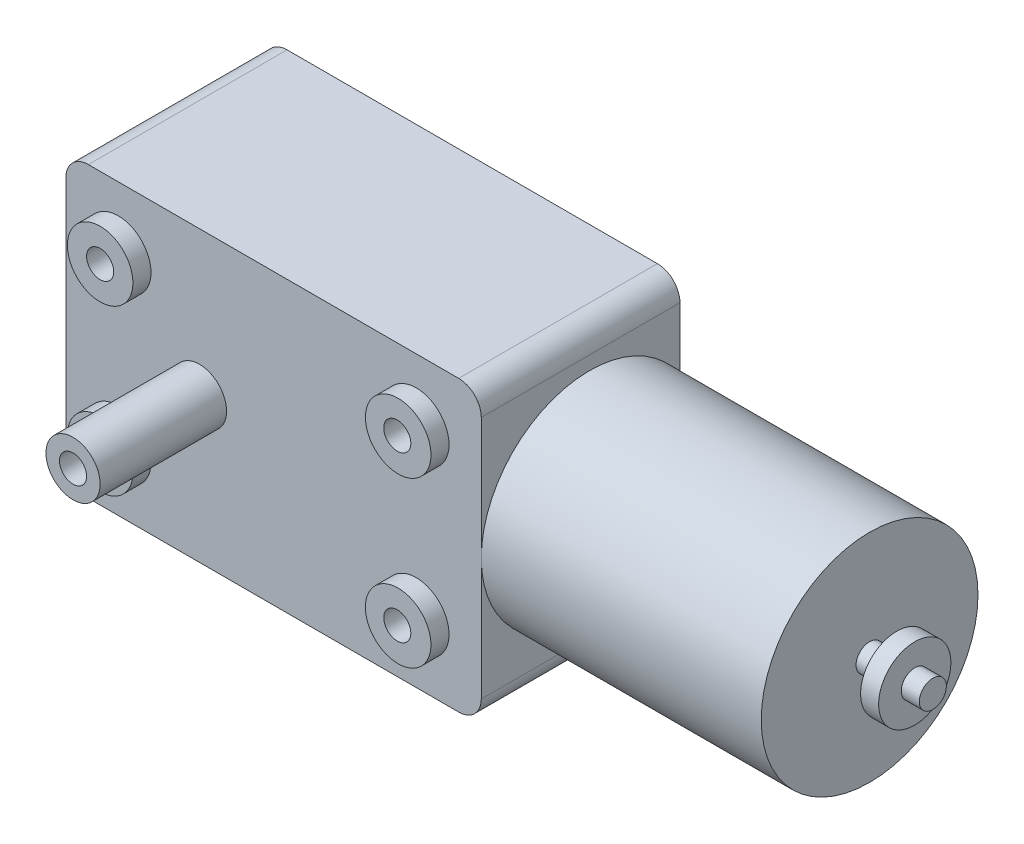
ISO-10303-21;
HEADER;
FILE_DESCRIPTION(('STEP AP214'),'2;1');
FILE_NAME('part.step','',(''),(''),'','','');
FILE_SCHEMA(('AUTOMOTIVE_DESIGN { 1 0 10303 214 1 1 1 1 }'));
ENDSEC;
DATA;
#1=APPLICATION_CONTEXT('core data for automotive mechanical design processes');
#2=APPLICATION_PROTOCOL_DEFINITION('international standard','automotive_design',2000,#1);
#3=PRODUCT_CONTEXT('',#1,'mechanical');
#4=PRODUCT('Part','Part','',(#3));
#5=PRODUCT_RELATED_PRODUCT_CATEGORY('part','',(#4));
#6=PRODUCT_DEFINITION_FORMATION('','',#4);
#7=PRODUCT_DEFINITION_CONTEXT('part definition',#1,'design');
#8=PRODUCT_DEFINITION('design','',#6,#7);
#9=PRODUCT_DEFINITION_SHAPE('','',#8);
#10=(LENGTH_UNIT() NAMED_UNIT(*) SI_UNIT(.MILLI.,.METRE.));
#11=(NAMED_UNIT(*) PLANE_ANGLE_UNIT() SI_UNIT($,.RADIAN.));
#12=(NAMED_UNIT(*) SI_UNIT($,.STERADIAN.) SOLID_ANGLE_UNIT());
#13=UNCERTAINTY_MEASURE_WITH_UNIT(LENGTH_MEASURE(1.E-05),#10,'distance_accuracy_value','');
#14=(GEOMETRIC_REPRESENTATION_CONTEXT(3) GLOBAL_UNCERTAINTY_ASSIGNED_CONTEXT((#13)) GLOBAL_UNIT_ASSIGNED_CONTEXT((#10,
#11,#12)) REPRESENTATION_CONTEXT('',''));
#15=CARTESIAN_POINT('',(0.,0.,0.));
#16=DIRECTION('',(0.,0.,1.));
#17=DIRECTION('',(1.,0.,0.));
#18=AXIS2_PLACEMENT_3D('',#15,#16,#17);
#19=CARTESIAN_POINT('',(61.,0.,10.));
#20=DIRECTION('',(-1.,0.,0.));
#21=DIRECTION('',(0.,0.,1.));
#22=AXIS2_PLACEMENT_3D('',#19,#20,#21);
#23=CYLINDRICAL_SURFACE('',#22,1.5);
#24=CARTESIAN_POINT('',(54.,0.,10.));
#25=DIRECTION('',(1.,0.,0.));
#26=DIRECTION('',(0.,0.,-1.));
#27=AXIS2_PLACEMENT_3D('',#24,#25,#26);
#28=CIRCLE('',#27,1.5);
#29=CARTESIAN_POINT('',(54.,0.,8.5));
#30=VERTEX_POINT('',#29);
#31=EDGE_CURVE('E149',#30,#30,#28,.T.);
#32=ORIENTED_EDGE('',*,*,#31,.T.);
#33=EDGE_LOOP('',(#32));
#34=FACE_BOUND('',#33,.T.);
#35=CARTESIAN_POINT('',(57.,0.,10.));
#36=DIRECTION('',(1.,0.,0.));
#37=DIRECTION('',(0.,0.,-1.));
#38=AXIS2_PLACEMENT_3D('',#35,#36,#37);
#39=CIRCLE('',#38,1.5);
#40=CARTESIAN_POINT('',(57.,0.,8.5));
#41=VERTEX_POINT('',#40);
#42=EDGE_CURVE('E11',#41,#41,#39,.T.);
#43=ORIENTED_EDGE('',*,*,#42,.F.);
#44=EDGE_LOOP('',(#43));
#45=FACE_BOUND('',#44,.T.);
#46=ADVANCED_FACE('F47',(#34,#45),#23,.T.);
#47=CARTESIAN_POINT('',(23.,-13.5,22.));
#48=DIRECTION('',(-1.,0.,0.));
#49=DIRECTION('',(0.,0.,1.));
#50=AXIS2_PLACEMENT_3D('',#47,#48,#49);
#51=PLANE('',#50);
#52=CARTESIAN_POINT('',(23.,0.,10.));
#53=DIRECTION('',(1.,0.,0.));
#54=DIRECTION('',(0.,0.,-1.));
#55=AXIS2_PLACEMENT_3D('',#52,#53,#54);
#56=CIRCLE('',#55,12.);
#57=CARTESIAN_POINT('',(23.,0.,22.));
#58=VERTEX_POINT('',#57);
#59=CARTESIAN_POINT('',(23.,-6.6332495807108,0.));
#60=VERTEX_POINT('',#59);
#61=EDGE_CURVE('E63',#58,#60,#56,.T.);
#62=ORIENTED_EDGE('',*,*,#61,.F.);
#63=DIRECTION('',(0.,1.,0.));
#64=VECTOR('',#63,1.);
#65=CARTESIAN_POINT('',(23.,-13.5,22.));
#66=LINE('',#65,#64);
#67=CARTESIAN_POINT('',(23.,-13.5,22.));
#68=VERTEX_POINT('',#67);
#69=EDGE_CURVE('E215',#68,#58,#66,.T.);
#70=ORIENTED_EDGE('',*,*,#69,.F.);
#71=DIRECTION('',(0.,0.,-1.));
#72=VECTOR('',#71,1.);
#73=CARTESIAN_POINT('',(23.,-13.5,22.));
#74=LINE('',#73,#72);
#75=CARTESIAN_POINT('',(23.,-13.5,0.));
#76=VERTEX_POINT('',#75);
#77=EDGE_CURVE('E257',#68,#76,#74,.T.);
#78=ORIENTED_EDGE('',*,*,#77,.T.);
#79=DIRECTION('',(0.,1.,0.));
#80=VECTOR('',#79,1.);
#81=CARTESIAN_POINT('',(23.,-13.5,0.));
#82=LINE('',#81,#80);
#83=EDGE_CURVE('E132',#76,#60,#82,.T.);
#84=ORIENTED_EDGE('',*,*,#83,.T.);
#85=EDGE_LOOP('',(#62,#70,#78,#84));
#86=FACE_BOUND('',#85,.T.);
#87=ADVANCED_FACE('F277',(#86),#51,.F.);
#88=CARTESIAN_POINT('',(-20.5,16.,22.));
#89=DIRECTION('',(0.,1.,0.));
#90=DIRECTION('',(0.,0.,1.));
#91=AXIS2_PLACEMENT_3D('',#88,#89,#90);
#92=PLANE('',#91);
#93=DIRECTION('',(1.,0.,0.));
#94=VECTOR('',#93,1.);
#95=CARTESIAN_POINT('',(-20.5,16.,0.));
#96=LINE('',#95,#94);
#97=CARTESIAN_POINT('',(-20.5,16.,0.));
#98=VERTEX_POINT('',#97);
#99=CARTESIAN_POINT('',(20.5,16.,0.));
#100=VERTEX_POINT('',#99);
#101=EDGE_CURVE('E206',#98,#100,#96,.T.);
#102=ORIENTED_EDGE('',*,*,#101,.F.);
#103=DIRECTION('',(0.,0.,-1.));
#104=VECTOR('',#103,1.);
#105=CARTESIAN_POINT('',(-20.5,16.,22.));
#106=LINE('',#105,#104);
#107=CARTESIAN_POINT('',(-20.5,16.,22.));
#108=VERTEX_POINT('',#107);
#109=EDGE_CURVE('E56',#108,#98,#106,.T.);
#110=ORIENTED_EDGE('',*,*,#109,.F.);
#111=DIRECTION('',(1.,0.,0.));
#112=VECTOR('',#111,1.);
#113=CARTESIAN_POINT('',(-20.5,16.,22.));
#114=LINE('',#113,#112);
#115=CARTESIAN_POINT('',(20.5,16.,22.));
#116=VERTEX_POINT('',#115);
#117=EDGE_CURVE('E209',#108,#116,#114,.T.);
#118=ORIENTED_EDGE('',*,*,#117,.T.);
#119=DIRECTION('',(0.,0.,-1.));
#120=VECTOR('',#119,1.);
#121=CARTESIAN_POINT('',(20.5,16.,22.));
#122=LINE('',#121,#120);
#123=EDGE_CURVE('E231',#116,#100,#122,.T.);
#124=ORIENTED_EDGE('',*,*,#123,.T.);
#125=EDGE_LOOP('',(#102,#110,#118,#124));
#126=FACE_BOUND('',#125,.T.);
#127=ADVANCED_FACE('F49',(#126),#92,.T.);
#128=CARTESIAN_POINT('',(-20.5,13.5,22.));
#129=DIRECTION('',(0.,0.,-1.));
#130=DIRECTION('',(-1.,0.,0.));
#131=AXIS2_PLACEMENT_3D('',#128,#129,#130);
#132=CYLINDRICAL_SURFACE('',#131,2.5);
#133=CARTESIAN_POINT('',(-20.5,13.5,0.));
#134=DIRECTION('',(0.,0.,-1.));
#135=DIRECTION('',(-1.,0.,0.));
#136=AXIS2_PLACEMENT_3D('',#133,#134,#135);
#137=CIRCLE('',#136,2.5);
#138=CARTESIAN_POINT('',(-23.,13.5,0.));
#139=VERTEX_POINT('',#138);
#140=EDGE_CURVE('E213',#139,#98,#137,.T.);
#141=ORIENTED_EDGE('',*,*,#140,.F.);
#142=DIRECTION('',(0.,0.,-1.));
#143=VECTOR('',#142,1.);
#144=CARTESIAN_POINT('',(-23.,13.5,22.));
#145=LINE('',#144,#143);
#146=CARTESIAN_POINT('',(-23.,13.5,22.));
#147=VERTEX_POINT('',#146);
#148=EDGE_CURVE('E249',#147,#139,#145,.T.);
#149=ORIENTED_EDGE('',*,*,#148,.F.);
#150=CARTESIAN_POINT('',(-20.5,13.5,22.));
#151=DIRECTION('',(0.,0.,-1.));
#152=DIRECTION('',(-1.,0.,0.));
#153=AXIS2_PLACEMENT_3D('',#150,#151,#152);
#154=CIRCLE('',#153,2.5);
#155=EDGE_CURVE('E228',#147,#108,#154,.T.);
#156=ORIENTED_EDGE('',*,*,#155,.T.);
#157=ORIENTED_EDGE('',*,*,#109,.T.);
#158=EDGE_LOOP('',(#141,#149,#156,#157));
#159=FACE_BOUND('',#158,.T.);
#160=ADVANCED_FACE('F271',(#159),#132,.T.);
#161=CARTESIAN_POINT('',(-23.,-13.5,22.));
#162=DIRECTION('',(-1.,0.,0.));
#163=DIRECTION('',(0.,0.,1.));
#164=AXIS2_PLACEMENT_3D('',#161,#162,#163);
#165=PLANE('',#164);
#166=DIRECTION('',(0.,1.,0.));
#167=VECTOR('',#166,1.);
#168=CARTESIAN_POINT('',(-23.,-13.5,0.));
#169=LINE('',#168,#167);
#170=CARTESIAN_POINT('',(-23.,-13.5,0.));
#171=VERTEX_POINT('',#170);
#172=EDGE_CURVE('E243',#171,#139,#169,.T.);
#173=ORIENTED_EDGE('',*,*,#172,.F.);
#174=DIRECTION('',(0.,0.,-1.));
#175=VECTOR('',#174,1.);
#176=CARTESIAN_POINT('',(-23.,-13.5,22.));
#177=LINE('',#176,#175);
#178=CARTESIAN_POINT('',(-23.,-13.5,22.));
#179=VERTEX_POINT('',#178);
#180=EDGE_CURVE('E251',#179,#171,#177,.T.);
#181=ORIENTED_EDGE('',*,*,#180,.F.);
#182=DIRECTION('',(0.,1.,0.));
#183=VECTOR('',#182,1.);
#184=CARTESIAN_POINT('',(-23.,-13.5,22.));
#185=LINE('',#184,#183);
#186=EDGE_CURVE('E225',#179,#147,#185,.T.);
#187=ORIENTED_EDGE('',*,*,#186,.T.);
#188=ORIENTED_EDGE('',*,*,#148,.T.);
#189=EDGE_LOOP('',(#173,#181,#187,#188));
#190=FACE_BOUND('',#189,.T.);
#191=ADVANCED_FACE('F291',(#190),#165,.T.);
#192=CARTESIAN_POINT('',(-20.5,-13.5,22.));
#193=DIRECTION('',(0.,0.,-1.));
#194=DIRECTION('',(-1.,0.,0.));
#195=AXIS2_PLACEMENT_3D('',#192,#193,#194);
#196=CYLINDRICAL_SURFACE('',#195,2.5);
#197=CARTESIAN_POINT('',(-20.5,-13.5,0.));
#198=DIRECTION('',(0.,0.,-1.));
#199=DIRECTION('',(-1.,0.,0.));
#200=AXIS2_PLACEMENT_3D('',#197,#198,#199);
#201=CIRCLE('',#200,2.5);
#202=CARTESIAN_POINT('',(-20.5,-16.,0.));
#203=VERTEX_POINT('',#202);
#204=EDGE_CURVE('E240',#203,#171,#201,.T.);
#205=ORIENTED_EDGE('',*,*,#204,.F.);
#206=DIRECTION('',(0.,0.,-1.));
#207=VECTOR('',#206,1.);
#208=CARTESIAN_POINT('',(-20.5,-16.,22.));
#209=LINE('',#208,#207);
#210=CARTESIAN_POINT('',(-20.5,-16.,22.));
#211=VERTEX_POINT('',#210);
#212=EDGE_CURVE('E253',#211,#203,#209,.T.);
#213=ORIENTED_EDGE('',*,*,#212,.F.);
#214=CARTESIAN_POINT('',(-20.5,-13.5,22.));
#215=DIRECTION('',(0.,0.,-1.));
#216=DIRECTION('',(-1.,0.,0.));
#217=AXIS2_PLACEMENT_3D('',#214,#215,#216);
#218=CIRCLE('',#217,2.5);
#219=EDGE_CURVE('E222',#211,#179,#218,.T.);
#220=ORIENTED_EDGE('',*,*,#219,.T.);
#221=ORIENTED_EDGE('',*,*,#180,.T.);
#222=EDGE_LOOP('',(#205,#213,#220,#221));
#223=FACE_BOUND('',#222,.T.);
#224=ADVANCED_FACE('F288',(#223),#196,.T.);
#225=CARTESIAN_POINT('',(-20.5,-16.,22.));
#226=DIRECTION('',(0.,1.,0.));
#227=DIRECTION('',(0.,0.,1.));
#228=AXIS2_PLACEMENT_3D('',#225,#226,#227);
#229=PLANE('',#228);
#230=DIRECTION('',(1.,0.,0.));
#231=VECTOR('',#230,1.);
#232=CARTESIAN_POINT('',(-20.5,-16.,0.));
#233=LINE('',#232,#231);
#234=CARTESIAN_POINT('',(20.5,-16.,0.));
#235=VERTEX_POINT('',#234);
#236=EDGE_CURVE('E237',#203,#235,#233,.T.);
#237=ORIENTED_EDGE('',*,*,#236,.T.);
#238=DIRECTION('',(0.,0.,-1.));
#239=VECTOR('',#238,1.);
#240=CARTESIAN_POINT('',(20.5,-16.,22.));
#241=LINE('',#240,#239);
#242=CARTESIAN_POINT('',(20.5,-16.,22.));
#243=VERTEX_POINT('',#242);
#244=EDGE_CURVE('E255',#243,#235,#241,.T.);
#245=ORIENTED_EDGE('',*,*,#244,.F.);
#246=DIRECTION('',(1.,0.,0.));
#247=VECTOR('',#246,1.);
#248=CARTESIAN_POINT('',(-20.5,-16.,22.));
#249=LINE('',#248,#247);
#250=EDGE_CURVE('E220',#211,#243,#249,.T.);
#251=ORIENTED_EDGE('',*,*,#250,.F.);
#252=ORIENTED_EDGE('',*,*,#212,.T.);
#253=EDGE_LOOP('',(#237,#245,#251,#252));
#254=FACE_BOUND('',#253,.T.);
#255=ADVANCED_FACE('F285',(#254),#229,.F.);
#256=CARTESIAN_POINT('',(20.5,-13.5,22.));
#257=DIRECTION('',(0.,0.,-1.));
#258=DIRECTION('',(-1.,0.,0.));
#259=AXIS2_PLACEMENT_3D('',#256,#257,#258);
#260=CYLINDRICAL_SURFACE('',#259,2.5);
#261=CARTESIAN_POINT('',(20.5,-13.5,0.));
#262=DIRECTION('',(0.,0.,-1.));
#263=DIRECTION('',(-1.,0.,0.));
#264=AXIS2_PLACEMENT_3D('',#261,#262,#263);
#265=CIRCLE('',#264,2.5);
#266=EDGE_CURVE('E234',#76,#235,#265,.T.);
#267=ORIENTED_EDGE('',*,*,#266,.F.);
#268=ORIENTED_EDGE('',*,*,#77,.F.);
#269=CARTESIAN_POINT('',(20.5,-13.5,22.));
#270=DIRECTION('',(0.,0.,-1.));
#271=DIRECTION('',(-1.,0.,0.));
#272=AXIS2_PLACEMENT_3D('',#269,#270,#271);
#273=CIRCLE('',#272,2.5);
#274=EDGE_CURVE('E217',#68,#243,#273,.T.);
#275=ORIENTED_EDGE('',*,*,#274,.T.);
#276=ORIENTED_EDGE('',*,*,#244,.T.);
#277=EDGE_LOOP('',(#267,#268,#275,#276));
#278=FACE_BOUND('',#277,.T.);
#279=ADVANCED_FACE('F281',(#278),#260,.T.);
#280=CARTESIAN_POINT('',(23.,6.63324958071081,0.));
#281=VERTEX_POINT('',#280);
#282=EDGE_CURVE('E134',#281,#58,#56,.T.);
#283=ORIENTED_EDGE('',*,*,#282,.F.);
#284=CARTESIAN_POINT('',(23.,13.5,0.));
#285=VERTEX_POINT('',#284);
#286=EDGE_CURVE('E122',#281,#285,#82,.T.);
#287=ORIENTED_EDGE('',*,*,#286,.T.);
#288=DIRECTION('',(0.,0.,-1.));
#289=VECTOR('',#288,1.);
#290=CARTESIAN_POINT('',(23.,13.5,22.));
#291=LINE('',#290,#289);
#292=CARTESIAN_POINT('',(23.,13.5,22.));
#293=VERTEX_POINT('',#292);
#294=EDGE_CURVE('E259',#293,#285,#291,.T.);
#295=ORIENTED_EDGE('',*,*,#294,.F.);
#296=EDGE_CURVE('E136',#58,#293,#66,.T.);
#297=ORIENTED_EDGE('',*,*,#296,.F.);
#298=EDGE_LOOP('',(#283,#287,#295,#297));
#299=FACE_BOUND('',#298,.T.);
#300=ADVANCED_FACE('F135',(#299),#51,.F.);
#301=CARTESIAN_POINT('',(20.5,13.5,22.));
#302=DIRECTION('',(0.,0.,-1.));
#303=DIRECTION('',(-1.,0.,0.));
#304=AXIS2_PLACEMENT_3D('',#301,#302,#303);
#305=CYLINDRICAL_SURFACE('',#304,2.5);
#306=CARTESIAN_POINT('',(20.5,13.5,0.));
#307=DIRECTION('',(0.,0.,1.));
#308=DIRECTION('',(1.,0.,0.));
#309=AXIS2_PLACEMENT_3D('',#306,#307,#308);
#310=CIRCLE('',#309,2.5);
#311=EDGE_CURVE('E127',#285,#100,#310,.T.);
#312=ORIENTED_EDGE('',*,*,#311,.T.);
#313=ORIENTED_EDGE('',*,*,#123,.F.);
#314=CARTESIAN_POINT('',(20.5,13.5,22.));
#315=DIRECTION('',(0.,0.,1.));
#316=DIRECTION('',(1.,0.,0.));
#317=AXIS2_PLACEMENT_3D('',#314,#315,#316);
#318=CIRCLE('',#317,2.5);
#319=EDGE_CURVE('E212',#293,#116,#318,.T.);
#320=ORIENTED_EDGE('',*,*,#319,.F.);
#321=ORIENTED_EDGE('',*,*,#294,.T.);
#322=EDGE_LOOP('',(#312,#313,#320,#321));
#323=FACE_BOUND('',#322,.T.);
#324=ADVANCED_FACE('F267',(#323),#305,.T.);
#325=CARTESIAN_POINT('',(20.5,13.5,22.));
#326=DIRECTION('',(0.,0.,1.));
#327=DIRECTION('',(1.,0.,0.));
#328=AXIS2_PLACEMENT_3D('',#325,#326,#327);
#329=PLANE('',#328);
#330=CARTESIAN_POINT('',(15.8000000000003,-9.09,22.));
#331=DIRECTION('',(0.,0.,1.));
#332=DIRECTION('',(1.,0.,0.));
#333=AXIS2_PLACEMENT_3D('',#330,#331,#332);
#334=CIRCLE('',#333,3.63);
#335=CARTESIAN_POINT('',(19.4300000000003,-9.09,22.));
#336=VERTEX_POINT('',#335);
#337=EDGE_CURVE('E179',#336,#336,#334,.T.);
#338=ORIENTED_EDGE('',*,*,#337,.F.);
#339=EDGE_LOOP('',(#338));
#340=FACE_BOUND('',#339,.T.);
#341=CARTESIAN_POINT('',(15.8,9.11,22.));
#342=DIRECTION('',(0.,0.,1.));
#343=DIRECTION('',(1.,0.,0.));
#344=AXIS2_PLACEMENT_3D('',#341,#342,#343);
#345=CIRCLE('',#344,3.63);
#346=CARTESIAN_POINT('',(19.43,9.11,22.));
#347=VERTEX_POINT('',#346);
#348=EDGE_CURVE('E185',#347,#347,#345,.T.);
#349=ORIENTED_EDGE('',*,*,#348,.F.);
#350=EDGE_LOOP('',(#349));
#351=FACE_BOUND('',#350,.T.);
#352=CARTESIAN_POINT('',(-17.1999999999997,-9.09,22.));
#353=DIRECTION('',(0.,0.,1.));
#354=DIRECTION('',(1.,0.,0.));
#355=AXIS2_PLACEMENT_3D('',#352,#353,#354);
#356=CIRCLE('',#355,3.63);
#357=CARTESIAN_POINT('',(-13.5699999999997,-9.09,22.));
#358=VERTEX_POINT('',#357);
#359=EDGE_CURVE('E191',#358,#358,#356,.T.);
#360=ORIENTED_EDGE('',*,*,#359,.F.);
#361=EDGE_LOOP('',(#360));
#362=FACE_BOUND('',#361,.T.);
#363=CARTESIAN_POINT('',(-17.2,9.11,22.));
#364=DIRECTION('',(0.,0.,1.));
#365=DIRECTION('',(1.,0.,0.));
#366=AXIS2_PLACEMENT_3D('',#363,#364,#365);
#367=CIRCLE('',#366,3.63);
#368=CARTESIAN_POINT('',(-13.57,9.11,22.));
#369=VERTEX_POINT('',#368);
#370=EDGE_CURVE('E194',#369,#369,#367,.T.);
#371=ORIENTED_EDGE('',*,*,#370,.F.);
#372=EDGE_LOOP('',(#371));
#373=FACE_BOUND('',#372,.T.);
#374=CARTESIAN_POINT('',(-8.2,0.,22.));
#375=DIRECTION('',(0.,0.,1.));
#376=DIRECTION('',(1.,0.,0.));
#377=AXIS2_PLACEMENT_3D('',#374,#375,#376);
#378=CIRCLE('',#377,3.);
#379=CARTESIAN_POINT('',(-5.2,0.,22.));
#380=VERTEX_POINT('',#379);
#381=EDGE_CURVE('E200',#380,#380,#378,.T.);
#382=ORIENTED_EDGE('',*,*,#381,.F.);
#383=EDGE_LOOP('',(#382));
#384=FACE_BOUND('',#383,.T.);
#385=ORIENTED_EDGE('',*,*,#117,.F.);
#386=ORIENTED_EDGE('',*,*,#155,.F.);
#387=ORIENTED_EDGE('',*,*,#186,.F.);
#388=ORIENTED_EDGE('',*,*,#219,.F.);
#389=ORIENTED_EDGE('',*,*,#250,.T.);
#390=ORIENTED_EDGE('',*,*,#274,.F.);
#391=ORIENTED_EDGE('',*,*,#69,.T.);
#392=ORIENTED_EDGE('',*,*,#296,.T.);
#393=ORIENTED_EDGE('',*,*,#319,.T.);
#394=EDGE_LOOP('',(#385,#386,#387,#388,#389,#390,#391,#392,#393));
#395=FACE_BOUND('',#394,.T.);
#396=ADVANCED_FACE('F274',(#340,#351,#362,#373,#384,#395),#329,.T.);
#397=CARTESIAN_POINT('',(20.5,13.5,0.));
#398=DIRECTION('',(0.,0.,1.));
#399=DIRECTION('',(1.,0.,0.));
#400=AXIS2_PLACEMENT_3D('',#397,#398,#399);
#401=PLANE('',#400);
#402=ORIENTED_EDGE('',*,*,#101,.T.);
#403=ORIENTED_EDGE('',*,*,#311,.F.);
#404=ORIENTED_EDGE('',*,*,#286,.F.);
#405=EDGE_CURVE('E71',#60,#281,#82,.T.);
#406=ORIENTED_EDGE('',*,*,#405,.F.);
#407=ORIENTED_EDGE('',*,*,#83,.F.);
#408=ORIENTED_EDGE('',*,*,#266,.T.);
#409=ORIENTED_EDGE('',*,*,#236,.F.);
#410=ORIENTED_EDGE('',*,*,#204,.T.);
#411=ORIENTED_EDGE('',*,*,#172,.T.);
#412=ORIENTED_EDGE('',*,*,#140,.T.);
#413=EDGE_LOOP('',(#402,#403,#404,#406,#407,#408,#409,#410,#411,#412));
#414=FACE_BOUND('',#413,.T.);
#415=ADVANCED_FACE('F125',(#414),#401,.F.);
#416=CARTESIAN_POINT('',(-8.2,0.,36.));
#417=DIRECTION('',(0.,0.,-1.));
#418=DIRECTION('',(-1.,0.,0.));
#419=AXIS2_PLACEMENT_3D('',#416,#417,#418);
#420=CYLINDRICAL_SURFACE('',#419,3.);
#421=CARTESIAN_POINT('',(-8.2,0.,36.));
#422=DIRECTION('',(0.,0.,1.));
#423=DIRECTION('',(1.,0.,0.));
#424=AXIS2_PLACEMENT_3D('',#421,#422,#423);
#425=CIRCLE('',#424,3.);
#426=CARTESIAN_POINT('',(-5.2,0.,36.));
#427=VERTEX_POINT('',#426);
#428=EDGE_CURVE('E203',#427,#427,#425,.T.);
#429=ORIENTED_EDGE('',*,*,#428,.F.);
#430=EDGE_LOOP('',(#429));
#431=FACE_BOUND('',#430,.T.);
#432=ORIENTED_EDGE('',*,*,#381,.T.);
#433=EDGE_LOOP('',(#432));
#434=FACE_BOUND('',#433,.T.);
#435=ADVANCED_FACE('F355',(#431,#434),#420,.T.);
#436=CARTESIAN_POINT('',(-8.2,0.,36.));
#437=DIRECTION('',(0.,0.,1.));
#438=DIRECTION('',(1.,0.,0.));
#439=AXIS2_PLACEMENT_3D('',#436,#437,#438);
#440=PLANE('',#439);
#441=CARTESIAN_POINT('',(-8.2,0.,36.));
#442=DIRECTION('',(0.,0.,1.));
#443=DIRECTION('',(1.,0.,0.));
#444=AXIS2_PLACEMENT_3D('',#441,#442,#443);
#445=CIRCLE('',#444,1.5);
#446=CARTESIAN_POINT('',(-6.7,0.,36.));
#447=VERTEX_POINT('',#446);
#448=EDGE_CURVE('E343',#447,#447,#445,.T.);
#449=ORIENTED_EDGE('',*,*,#448,.F.);
#450=EDGE_LOOP('',(#449));
#451=FACE_BOUND('',#450,.T.);
#452=ORIENTED_EDGE('',*,*,#428,.T.);
#453=EDGE_LOOP('',(#452));
#454=FACE_BOUND('',#453,.T.);
#455=ADVANCED_FACE('F352',(#451,#454),#440,.T.);
#456=CARTESIAN_POINT('',(-17.2,9.11,24.));
#457=DIRECTION('',(0.,0.,-1.));
#458=DIRECTION('',(-1.,0.,0.));
#459=AXIS2_PLACEMENT_3D('',#456,#457,#458);
#460=CYLINDRICAL_SURFACE('',#459,3.63);
#461=CARTESIAN_POINT('',(-17.2,9.11,24.));
#462=DIRECTION('',(0.,0.,1.));
#463=DIRECTION('',(1.,0.,0.));
#464=AXIS2_PLACEMENT_3D('',#461,#462,#463);
#465=CIRCLE('',#464,3.63);
#466=CARTESIAN_POINT('',(-13.57,9.11,24.));
#467=VERTEX_POINT('',#466);
#468=EDGE_CURVE('E197',#467,#467,#465,.T.);
#469=ORIENTED_EDGE('',*,*,#468,.F.);
#470=EDGE_LOOP('',(#469));
#471=FACE_BOUND('',#470,.T.);
#472=ORIENTED_EDGE('',*,*,#370,.T.);
#473=EDGE_LOOP('',(#472));
#474=FACE_BOUND('',#473,.T.);
#475=ADVANCED_FACE('F354',(#471,#474),#460,.T.);
#476=CARTESIAN_POINT('',(-17.2,9.11,24.));
#477=DIRECTION('',(0.,0.,1.));
#478=DIRECTION('',(1.,0.,0.));
#479=AXIS2_PLACEMENT_3D('',#476,#477,#478);
#480=PLANE('',#479);
#481=CARTESIAN_POINT('',(-17.2,9.11,24.));
#482=DIRECTION('',(0.,0.,1.));
#483=DIRECTION('',(1.,0.,0.));
#484=AXIS2_PLACEMENT_3D('',#481,#482,#483);
#485=CIRCLE('',#484,1.5);
#486=CARTESIAN_POINT('',(-15.7,9.11,24.));
#487=VERTEX_POINT('',#486);
#488=EDGE_CURVE('E164',#487,#487,#485,.T.);
#489=ORIENTED_EDGE('',*,*,#488,.F.);
#490=EDGE_LOOP('',(#489));
#491=FACE_BOUND('',#490,.T.);
#492=ORIENTED_EDGE('',*,*,#468,.T.);
#493=EDGE_LOOP('',(#492));
#494=FACE_BOUND('',#493,.T.);
#495=ADVANCED_FACE('F378',(#491,#494),#480,.T.);
#496=CARTESIAN_POINT('',(-17.1999999999997,-9.09,24.));
#497=DIRECTION('',(0.,0.,-1.));
#498=DIRECTION('',(-1.,0.,0.));
#499=AXIS2_PLACEMENT_3D('',#496,#497,#498);
#500=CYLINDRICAL_SURFACE('',#499,3.63);
#501=CARTESIAN_POINT('',(-17.1999999999997,-9.09,24.));
#502=DIRECTION('',(0.,0.,1.));
#503=DIRECTION('',(1.,0.,0.));
#504=AXIS2_PLACEMENT_3D('',#501,#502,#503);
#505=CIRCLE('',#504,3.63);
#506=CARTESIAN_POINT('',(-13.5699999999997,-9.09,24.));
#507=VERTEX_POINT('',#506);
#508=EDGE_CURVE('E188',#507,#507,#505,.T.);
#509=ORIENTED_EDGE('',*,*,#508,.F.);
#510=EDGE_LOOP('',(#509));
#511=FACE_BOUND('',#510,.T.);
#512=ORIENTED_EDGE('',*,*,#359,.T.);
#513=EDGE_LOOP('',(#512));
#514=FACE_BOUND('',#513,.T.);
#515=ADVANCED_FACE('F382',(#511,#514),#500,.T.);
#516=CARTESIAN_POINT('',(-17.1999999999997,-9.09,24.));
#517=DIRECTION('',(0.,0.,1.));
#518=DIRECTION('',(1.,0.,0.));
#519=AXIS2_PLACEMENT_3D('',#516,#517,#518);
#520=PLANE('',#519);
#521=CARTESIAN_POINT('',(-17.1999999999998,-9.09,24.));
#522=DIRECTION('',(0.,0.,1.));
#523=DIRECTION('',(1.,0.,0.));
#524=AXIS2_PLACEMENT_3D('',#521,#522,#523);
#525=CIRCLE('',#524,1.5);
#526=CARTESIAN_POINT('',(-15.6999999999998,-9.09,24.));
#527=VERTEX_POINT('',#526);
#528=EDGE_CURVE('E161',#527,#527,#525,.T.);
#529=ORIENTED_EDGE('',*,*,#528,.F.);
#530=EDGE_LOOP('',(#529));
#531=FACE_BOUND('',#530,.T.);
#532=ORIENTED_EDGE('',*,*,#508,.T.);
#533=EDGE_LOOP('',(#532));
#534=FACE_BOUND('',#533,.T.);
#535=ADVANCED_FACE('F384',(#531,#534),#520,.T.);
#536=CARTESIAN_POINT('',(15.8,9.11,24.));
#537=DIRECTION('',(0.,0.,-1.));
#538=DIRECTION('',(-1.,0.,0.));
#539=AXIS2_PLACEMENT_3D('',#536,#537,#538);
#540=CYLINDRICAL_SURFACE('',#539,3.63);
#541=CARTESIAN_POINT('',(15.8,9.11,24.));
#542=DIRECTION('',(0.,0.,1.));
#543=DIRECTION('',(1.,0.,0.));
#544=AXIS2_PLACEMENT_3D('',#541,#542,#543);
#545=CIRCLE('',#544,3.63);
#546=CARTESIAN_POINT('',(19.43,9.11,24.));
#547=VERTEX_POINT('',#546);
#548=EDGE_CURVE('E182',#547,#547,#545,.T.);
#549=ORIENTED_EDGE('',*,*,#548,.F.);
#550=EDGE_LOOP('',(#549));
#551=FACE_BOUND('',#550,.T.);
#552=ORIENTED_EDGE('',*,*,#348,.T.);
#553=EDGE_LOOP('',(#552));
#554=FACE_BOUND('',#553,.T.);
#555=ADVANCED_FACE('F387',(#551,#554),#540,.T.);
#556=CARTESIAN_POINT('',(15.8,9.11,24.));
#557=DIRECTION('',(0.,0.,1.));
#558=DIRECTION('',(1.,0.,0.));
#559=AXIS2_PLACEMENT_3D('',#556,#557,#558);
#560=PLANE('',#559);
#561=CARTESIAN_POINT('',(15.7,9.11,24.));
#562=DIRECTION('',(0.,0.,1.));
#563=DIRECTION('',(1.,0.,0.));
#564=AXIS2_PLACEMENT_3D('',#561,#562,#563);
#565=CIRCLE('',#564,1.5);
#566=CARTESIAN_POINT('',(17.2,9.11,24.));
#567=VERTEX_POINT('',#566);
#568=EDGE_CURVE('E168',#567,#567,#565,.T.);
#569=ORIENTED_EDGE('',*,*,#568,.F.);
#570=EDGE_LOOP('',(#569));
#571=FACE_BOUND('',#570,.T.);
#572=ORIENTED_EDGE('',*,*,#548,.T.);
#573=EDGE_LOOP('',(#572));
#574=FACE_BOUND('',#573,.T.);
#575=ADVANCED_FACE('F392',(#571,#574),#560,.T.);
#576=CARTESIAN_POINT('',(15.8000000000003,-9.09,24.));
#577=DIRECTION('',(0.,0.,-1.));
#578=DIRECTION('',(-1.,0.,0.));
#579=AXIS2_PLACEMENT_3D('',#576,#577,#578);
#580=CYLINDRICAL_SURFACE('',#579,3.63);
#581=CARTESIAN_POINT('',(15.8000000000003,-9.09,24.));
#582=DIRECTION('',(0.,0.,1.));
#583=DIRECTION('',(1.,0.,0.));
#584=AXIS2_PLACEMENT_3D('',#581,#582,#583);
#585=CIRCLE('',#584,3.63);
#586=CARTESIAN_POINT('',(19.4300000000003,-9.09,24.));
#587=VERTEX_POINT('',#586);
#588=EDGE_CURVE('E176',#587,#587,#585,.T.);
#589=ORIENTED_EDGE('',*,*,#588,.F.);
#590=EDGE_LOOP('',(#589));
#591=FACE_BOUND('',#590,.T.);
#592=ORIENTED_EDGE('',*,*,#337,.T.);
#593=EDGE_LOOP('',(#592));
#594=FACE_BOUND('',#593,.T.);
#595=ADVANCED_FACE('F395',(#591,#594),#580,.T.);
#596=CARTESIAN_POINT('',(15.8000000000003,-9.09,24.));
#597=DIRECTION('',(0.,0.,1.));
#598=DIRECTION('',(1.,0.,0.));
#599=AXIS2_PLACEMENT_3D('',#596,#597,#598);
#600=PLANE('',#599);
#601=CARTESIAN_POINT('',(15.7000000000002,-9.09,24.));
#602=DIRECTION('',(0.,0.,1.));
#603=DIRECTION('',(1.,0.,0.));
#604=AXIS2_PLACEMENT_3D('',#601,#602,#603);
#605=CIRCLE('',#604,1.5);
#606=CARTESIAN_POINT('',(17.2000000000002,-9.09,24.));
#607=VERTEX_POINT('',#606);
#608=EDGE_CURVE('E154',#607,#607,#605,.T.);
#609=ORIENTED_EDGE('',*,*,#608,.F.);
#610=EDGE_LOOP('',(#609));
#611=FACE_BOUND('',#610,.T.);
#612=ORIENTED_EDGE('',*,*,#588,.T.);
#613=EDGE_LOOP('',(#612));
#614=FACE_BOUND('',#613,.T.);
#615=ADVANCED_FACE('F400',(#611,#614),#600,.T.);
#616=CARTESIAN_POINT('',(15.7000000000002,-9.09,20.5));
#617=DIRECTION('',(0.,0.,1.));
#618=DIRECTION('',(1.,0.,0.));
#619=AXIS2_PLACEMENT_3D('',#616,#617,#618);
#620=CYLINDRICAL_SURFACE('',#619,1.5);
#621=CARTESIAN_POINT('',(15.7000000000002,-9.09,20.5));
#622=DIRECTION('',(0.,0.,1.));
#623=DIRECTION('',(1.,0.,0.));
#624=AXIS2_PLACEMENT_3D('',#621,#622,#623);
#625=CIRCLE('',#624,1.5);
#626=CARTESIAN_POINT('',(17.2000000000002,-9.09,20.5));
#627=VERTEX_POINT('',#626);
#628=EDGE_CURVE('E158',#627,#627,#625,.T.);
#629=ORIENTED_EDGE('',*,*,#628,.F.);
#630=EDGE_LOOP('',(#629));
#631=FACE_BOUND('',#630,.T.);
#632=ORIENTED_EDGE('',*,*,#608,.T.);
#633=EDGE_LOOP('',(#632));
#634=FACE_BOUND('',#633,.T.);
#635=ADVANCED_FACE('F403',(#631,#634),#620,.F.);
#636=CARTESIAN_POINT('',(15.7000000000002,-9.09,20.5));
#637=DIRECTION('',(0.,0.,1.));
#638=DIRECTION('',(1.,0.,0.));
#639=AXIS2_PLACEMENT_3D('',#636,#637,#638);
#640=PLANE('',#639);
#641=ORIENTED_EDGE('',*,*,#628,.T.);
#642=EDGE_LOOP('',(#641));
#643=FACE_BOUND('',#642,.T.);
#644=ADVANCED_FACE('F425',(#643),#640,.T.);
#645=CARTESIAN_POINT('',(15.7,9.11,20.5));
#646=DIRECTION('',(0.,0.,1.));
#647=DIRECTION('',(1.,0.,0.));
#648=AXIS2_PLACEMENT_3D('',#645,#646,#647);
#649=CYLINDRICAL_SURFACE('',#648,1.5);
#650=CARTESIAN_POINT('',(15.7,9.11,20.5));
#651=DIRECTION('',(0.,0.,1.));
#652=DIRECTION('',(1.,0.,0.));
#653=AXIS2_PLACEMENT_3D('',#650,#651,#652);
#654=CIRCLE('',#653,1.5);
#655=CARTESIAN_POINT('',(17.2,9.11,20.5));
#656=VERTEX_POINT('',#655);
#657=EDGE_CURVE('E157',#656,#656,#654,.T.);
#658=ORIENTED_EDGE('',*,*,#657,.F.);
#659=EDGE_LOOP('',(#658));
#660=FACE_BOUND('',#659,.T.);
#661=ORIENTED_EDGE('',*,*,#568,.T.);
#662=EDGE_LOOP('',(#661));
#663=FACE_BOUND('',#662,.T.);
#664=ADVANCED_FACE('F421',(#660,#663),#649,.F.);
#665=CARTESIAN_POINT('',(15.7,9.11,20.5));
#666=DIRECTION('',(0.,0.,1.));
#667=DIRECTION('',(1.,0.,0.));
#668=AXIS2_PLACEMENT_3D('',#665,#666,#667);
#669=PLANE('',#668);
#670=ORIENTED_EDGE('',*,*,#657,.T.);
#671=EDGE_LOOP('',(#670));
#672=FACE_BOUND('',#671,.T.);
#673=ADVANCED_FACE('F417',(#672),#669,.T.);
#674=CARTESIAN_POINT('',(-17.1999999999998,-9.09,20.5));
#675=DIRECTION('',(0.,0.,1.));
#676=DIRECTION('',(1.,0.,0.));
#677=AXIS2_PLACEMENT_3D('',#674,#675,#676);
#678=CYLINDRICAL_SURFACE('',#677,1.5);
#679=CARTESIAN_POINT('',(-17.1999999999998,-9.09,20.5));
#680=DIRECTION('',(0.,0.,1.));
#681=DIRECTION('',(1.,0.,0.));
#682=AXIS2_PLACEMENT_3D('',#679,#680,#681);
#683=CIRCLE('',#682,1.5);
#684=CARTESIAN_POINT('',(-15.6999999999998,-9.09,20.5));
#685=VERTEX_POINT('',#684);
#686=EDGE_CURVE('E165',#685,#685,#683,.T.);
#687=ORIENTED_EDGE('',*,*,#686,.F.);
#688=EDGE_LOOP('',(#687));
#689=FACE_BOUND('',#688,.T.);
#690=ORIENTED_EDGE('',*,*,#528,.T.);
#691=EDGE_LOOP('',(#690));
#692=FACE_BOUND('',#691,.T.);
#693=ADVANCED_FACE('F420',(#689,#692),#678,.F.);
#694=CARTESIAN_POINT('',(-17.1999999999998,-9.09,20.5));
#695=DIRECTION('',(0.,0.,1.));
#696=DIRECTION('',(1.,0.,0.));
#697=AXIS2_PLACEMENT_3D('',#694,#695,#696);
#698=PLANE('',#697);
#699=ORIENTED_EDGE('',*,*,#686,.T.);
#700=EDGE_LOOP('',(#699));
#701=FACE_BOUND('',#700,.T.);
#702=ADVANCED_FACE('F412',(#701),#698,.T.);
#703=CARTESIAN_POINT('',(-17.2,9.11,20.5));
#704=DIRECTION('',(0.,0.,1.));
#705=DIRECTION('',(1.,0.,0.));
#706=AXIS2_PLACEMENT_3D('',#703,#704,#705);
#707=CYLINDRICAL_SURFACE('',#706,1.5);
#708=CARTESIAN_POINT('',(-17.2,9.11,20.5));
#709=DIRECTION('',(0.,0.,1.));
#710=DIRECTION('',(1.,0.,0.));
#711=AXIS2_PLACEMENT_3D('',#708,#709,#710);
#712=CIRCLE('',#711,1.5);
#713=CARTESIAN_POINT('',(-15.7,9.11,20.5));
#714=VERTEX_POINT('',#713);
#715=EDGE_CURVE('E173',#714,#714,#712,.T.);
#716=ORIENTED_EDGE('',*,*,#715,.F.);
#717=EDGE_LOOP('',(#716));
#718=FACE_BOUND('',#717,.T.);
#719=ORIENTED_EDGE('',*,*,#488,.T.);
#720=EDGE_LOOP('',(#719));
#721=FACE_BOUND('',#720,.T.);
#722=ADVANCED_FACE('F408',(#718,#721),#707,.F.);
#723=CARTESIAN_POINT('',(-17.2,9.11,20.5));
#724=DIRECTION('',(0.,0.,1.));
#725=DIRECTION('',(1.,0.,0.));
#726=AXIS2_PLACEMENT_3D('',#723,#724,#725);
#727=PLANE('',#726);
#728=ORIENTED_EDGE('',*,*,#715,.T.);
#729=EDGE_LOOP('',(#728));
#730=FACE_BOUND('',#729,.T.);
#731=ADVANCED_FACE('F411',(#730),#727,.T.);
#732=CARTESIAN_POINT('',(23.,0.,10.));
#733=DIRECTION('',(1.,0.,0.));
#734=DIRECTION('',(0.,0.,-1.));
#735=AXIS2_PLACEMENT_3D('',#732,#733,#734);
#736=PLANE('',#735);
#737=EDGE_CURVE('E142',#60,#281,#56,.T.);
#738=ORIENTED_EDGE('',*,*,#737,.F.);
#739=ORIENTED_EDGE('',*,*,#405,.T.);
#740=EDGE_LOOP('',(#738,#739));
#741=FACE_BOUND('',#740,.T.);
#742=ADVANCED_FACE('F145',(#741),#736,.F.);
#743=CARTESIAN_POINT('',(54.,0.,10.));
#744=DIRECTION('',(-1.,0.,0.));
#745=DIRECTION('',(0.,0.,1.));
#746=AXIS2_PLACEMENT_3D('',#743,#744,#745);
#747=CYLINDRICAL_SURFACE('',#746,12.);
#748=CARTESIAN_POINT('',(54.,0.,10.));
#749=DIRECTION('',(1.,0.,0.));
#750=DIRECTION('',(0.,0.,-1.));
#751=AXIS2_PLACEMENT_3D('',#748,#749,#750);
#752=CIRCLE('',#751,12.);
#753=CARTESIAN_POINT('',(54.,0.,-2.));
#754=VERTEX_POINT('',#753);
#755=EDGE_CURVE('E140',#754,#754,#752,.T.);
#756=ORIENTED_EDGE('',*,*,#755,.F.);
#757=EDGE_LOOP('',(#756));
#758=FACE_BOUND('',#757,.T.);
#759=ORIENTED_EDGE('',*,*,#282,.T.);
#760=ORIENTED_EDGE('',*,*,#61,.T.);
#761=ORIENTED_EDGE('',*,*,#737,.T.);
#762=EDGE_LOOP('',(#759,#760,#761));
#763=FACE_BOUND('',#762,.T.);
#764=ADVANCED_FACE('F146',(#758,#763),#747,.T.);
#765=CARTESIAN_POINT('',(54.,0.,10.));
#766=DIRECTION('',(1.,0.,0.));
#767=DIRECTION('',(0.,0.,-1.));
#768=AXIS2_PLACEMENT_3D('',#765,#766,#767);
#769=PLANE('',#768);
#770=ORIENTED_EDGE('',*,*,#31,.F.);
#771=EDGE_LOOP('',(#770));
#772=FACE_BOUND('',#771,.T.);
#773=ORIENTED_EDGE('',*,*,#755,.T.);
#774=EDGE_LOOP('',(#773));
#775=FACE_BOUND('',#774,.T.);
#776=ADVANCED_FACE('F441',(#772,#775),#769,.T.);
#777=CARTESIAN_POINT('',(59.,0.,10.));
#778=DIRECTION('',(-1.,0.,0.));
#779=DIRECTION('',(0.,0.,1.));
#780=AXIS2_PLACEMENT_3D('',#777,#778,#779);
#781=CYLINDRICAL_SURFACE('',#780,4.);
#782=CARTESIAN_POINT('',(59.,0.,10.));
#783=DIRECTION('',(1.,0.,0.));
#784=DIRECTION('',(0.,0.,-1.));
#785=AXIS2_PLACEMENT_3D('',#782,#783,#784);
#786=CIRCLE('',#785,4.);
#787=CARTESIAN_POINT('',(59.,0.,6.));
#788=VERTEX_POINT('',#787);
#789=EDGE_CURVE('E333',#788,#788,#786,.T.);
#790=ORIENTED_EDGE('',*,*,#789,.F.);
#791=EDGE_LOOP('',(#790));
#792=FACE_BOUND('',#791,.T.);
#793=CARTESIAN_POINT('',(57.,0.,10.));
#794=DIRECTION('',(1.,0.,0.));
#795=DIRECTION('',(0.,0.,-1.));
#796=AXIS2_PLACEMENT_3D('',#793,#794,#795);
#797=CIRCLE('',#796,4.);
#798=CARTESIAN_POINT('',(57.,0.,6.));
#799=VERTEX_POINT('',#798);
#800=EDGE_CURVE('E335',#799,#799,#797,.T.);
#801=ORIENTED_EDGE('',*,*,#800,.T.);
#802=EDGE_LOOP('',(#801));
#803=FACE_BOUND('',#802,.T.);
#804=ADVANCED_FACE('F445',(#792,#803),#781,.T.);
#805=CARTESIAN_POINT('',(59.,0.,10.));
#806=DIRECTION('',(1.,0.,0.));
#807=DIRECTION('',(0.,0.,-1.));
#808=AXIS2_PLACEMENT_3D('',#805,#806,#807);
#809=PLANE('',#808);
#810=CARTESIAN_POINT('',(59.,0.,10.));
#811=DIRECTION('',(1.,0.,0.));
#812=DIRECTION('',(0.,0.,-1.));
#813=AXIS2_PLACEMENT_3D('',#810,#811,#812);
#814=CIRCLE('',#813,1.5);
#815=CARTESIAN_POINT('',(59.,0.,8.5));
#816=VERTEX_POINT('',#815);
#817=EDGE_CURVE('E51',#816,#816,#814,.T.);
#818=ORIENTED_EDGE('',*,*,#817,.F.);
#819=EDGE_LOOP('',(#818));
#820=FACE_BOUND('',#819,.T.);
#821=ORIENTED_EDGE('',*,*,#789,.T.);
#822=EDGE_LOOP('',(#821));
#823=FACE_BOUND('',#822,.T.);
#824=ADVANCED_FACE('F450',(#820,#823),#809,.T.);
#825=CARTESIAN_POINT('',(57.,0.,10.));
#826=DIRECTION('',(1.,0.,0.));
#827=DIRECTION('',(0.,0.,-1.));
#828=AXIS2_PLACEMENT_3D('',#825,#826,#827);
#829=PLANE('',#828);
#830=ORIENTED_EDGE('',*,*,#42,.T.);
#831=EDGE_LOOP('',(#830));
#832=FACE_BOUND('',#831,.T.);
#833=ORIENTED_EDGE('',*,*,#800,.F.);
#834=EDGE_LOOP('',(#833));
#835=FACE_BOUND('',#834,.T.);
#836=ADVANCED_FACE('F326',(#832,#835),#829,.F.);
#837=CARTESIAN_POINT('',(61.,0.,10.));
#838=DIRECTION('',(1.,0.,0.));
#839=DIRECTION('',(0.,0.,-1.));
#840=AXIS2_PLACEMENT_3D('',#837,#838,#839);
#841=PLANE('',#840);
#842=CARTESIAN_POINT('',(61.,0.,10.));
#843=DIRECTION('',(1.,0.,0.));
#844=DIRECTION('',(0.,0.,-1.));
#845=AXIS2_PLACEMENT_3D('',#842,#843,#844);
#846=CIRCLE('',#845,1.5);
#847=CARTESIAN_POINT('',(61.,0.,8.5));
#848=VERTEX_POINT('',#847);
#849=EDGE_CURVE('E147',#848,#848,#846,.T.);
#850=ORIENTED_EDGE('',*,*,#849,.T.);
#851=EDGE_LOOP('',(#850));
#852=FACE_BOUND('',#851,.T.);
#853=ADVANCED_FACE('F316',(#852),#841,.T.);
#854=ORIENTED_EDGE('',*,*,#817,.T.);
#855=EDGE_LOOP('',(#854));
#856=FACE_BOUND('',#855,.T.);
#857=ORIENTED_EDGE('',*,*,#849,.F.);
#858=EDGE_LOOP('',(#857));
#859=FACE_BOUND('',#858,.T.);
#860=ADVANCED_FACE('F303',(#856,#859),#23,.T.);
#861=CARTESIAN_POINT('',(-8.2,0.,32.5));
#862=DIRECTION('',(0.,0.,1.));
#863=DIRECTION('',(1.,0.,0.));
#864=AXIS2_PLACEMENT_3D('',#861,#862,#863);
#865=CYLINDRICAL_SURFACE('',#864,1.5);
#866=CARTESIAN_POINT('',(-8.2,0.,32.5));
#867=DIRECTION('',(0.,0.,1.));
#868=DIRECTION('',(1.,0.,0.));
#869=AXIS2_PLACEMENT_3D('',#866,#867,#868);
#870=CIRCLE('',#869,1.5);
#871=CARTESIAN_POINT('',(-6.7,0.,32.5));
#872=VERTEX_POINT('',#871);
#873=EDGE_CURVE('E340',#872,#872,#870,.T.);
#874=ORIENTED_EDGE('',*,*,#873,.F.);
#875=EDGE_LOOP('',(#874));
#876=FACE_BOUND('',#875,.T.);
#877=ORIENTED_EDGE('',*,*,#448,.T.);
#878=EDGE_LOOP('',(#877));
#879=FACE_BOUND('',#878,.T.);
#880=ADVANCED_FACE('F315',(#876,#879),#865,.F.);
#881=CARTESIAN_POINT('',(-8.2,0.,32.5));
#882=DIRECTION('',(0.,0.,1.));
#883=DIRECTION('',(1.,0.,0.));
#884=AXIS2_PLACEMENT_3D('',#881,#882,#883);
#885=PLANE('',#884);
#886=ORIENTED_EDGE('',*,*,#873,.T.);
#887=EDGE_LOOP('',(#886));
#888=FACE_BOUND('',#887,.T.);
#889=ADVANCED_FACE('F323',(#888),#885,.T.);
#890=CLOSED_SHELL('',(#46,#87,#127,#160,#191,#224,#255,#279,#300,#324,#396,#415,#435,#455,#475,
#495,#515,#535,#555,#575,#595,#615,#635,#644,#664,#673,#693,#702,#722,#731,#742,#764,#776,#804,
#824,#836,#853,#860,#880,#889));
#891=MANIFOLD_SOLID_BREP('B2',#890);
#892=ADVANCED_BREP_SHAPE_REPRESENTATION('',(#18,#891),#14);
#893=SHAPE_DEFINITION_REPRESENTATION(#9,#892);
ENDSEC;
END-ISO-10303-21;
